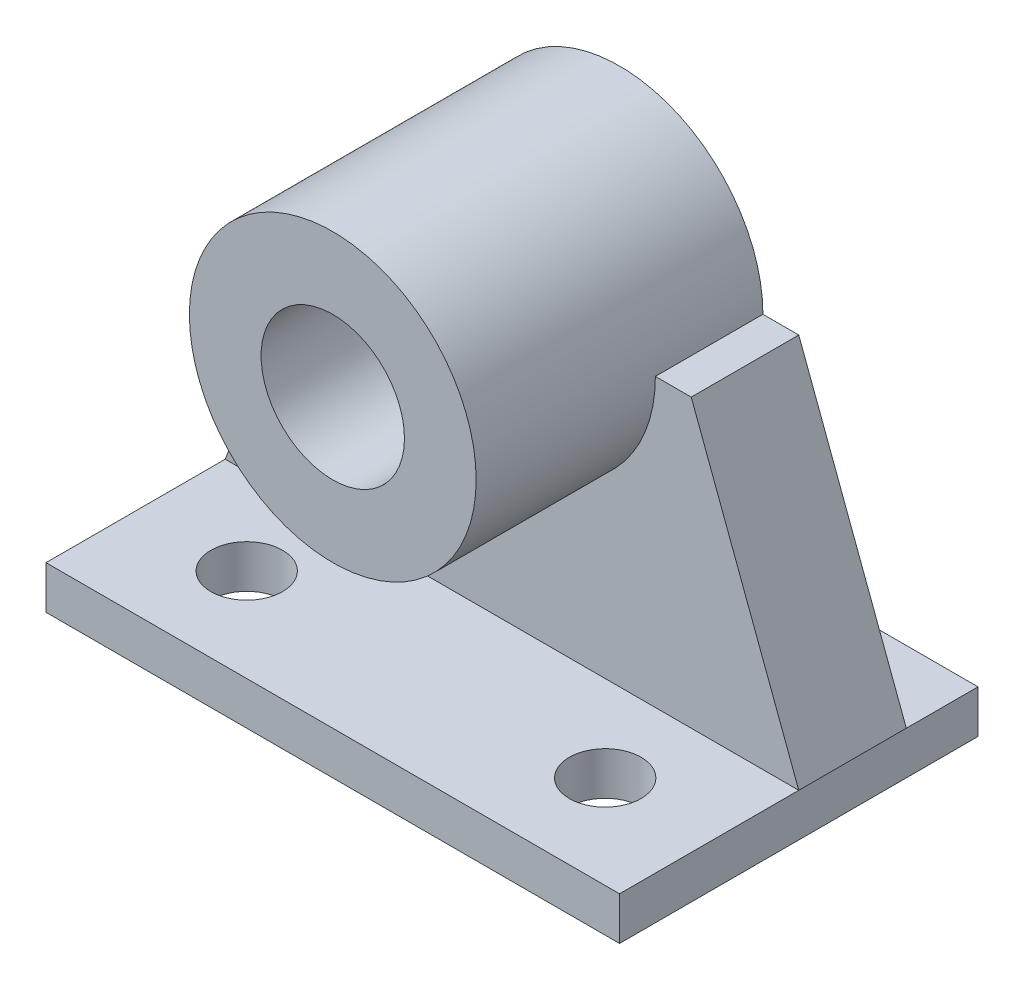
ISO-10303-21;
HEADER;
FILE_DESCRIPTION(('STEP AP214'),'2;1');
FILE_NAME('part.step','',(''),(''),'','','');
FILE_SCHEMA(('AUTOMOTIVE_DESIGN { 1 0 10303 214 1 1 1 1 }'));
ENDSEC;
DATA;
#1=APPLICATION_CONTEXT('core data for automotive mechanical design processes');
#2=APPLICATION_PROTOCOL_DEFINITION('international standard','automotive_design',2000,#1);
#3=PRODUCT_CONTEXT('',#1,'mechanical');
#4=PRODUCT('Part','Part','',(#3));
#5=PRODUCT_RELATED_PRODUCT_CATEGORY('part','',(#4));
#6=PRODUCT_DEFINITION_FORMATION('','',#4);
#7=PRODUCT_DEFINITION_CONTEXT('part definition',#1,'design');
#8=PRODUCT_DEFINITION('design','',#6,#7);
#9=PRODUCT_DEFINITION_SHAPE('','',#8);
#10=(LENGTH_UNIT() NAMED_UNIT(*) SI_UNIT(.MILLI.,.METRE.));
#11=(NAMED_UNIT(*) PLANE_ANGLE_UNIT() SI_UNIT($,.RADIAN.));
#12=(NAMED_UNIT(*) SI_UNIT($,.STERADIAN.) SOLID_ANGLE_UNIT());
#13=UNCERTAINTY_MEASURE_WITH_UNIT(LENGTH_MEASURE(1.E-05),#10,'distance_accuracy_value','');
#14=(GEOMETRIC_REPRESENTATION_CONTEXT(3) GLOBAL_UNCERTAINTY_ASSIGNED_CONTEXT((#13)) GLOBAL_UNIT_ASSIGNED_CONTEXT((#10,
#11,#12)) REPRESENTATION_CONTEXT('',''));
#15=CARTESIAN_POINT('',(0.,0.,0.));
#16=DIRECTION('',(0.,0.,1.));
#17=DIRECTION('',(1.,0.,0.));
#18=AXIS2_PLACEMENT_3D('',#15,#16,#17);
#19=CARTESIAN_POINT('',(0.,0.,0.));
#20=DIRECTION('',(0.,0.,1.));
#21=DIRECTION('',(1.,0.,0.));
#22=AXIS2_PLACEMENT_3D('',#19,#20,#21);
#23=PLANE('',#22);
#24=DIRECTION('',(1.,0.,0.));
#25=VECTOR('',#24,1.);
#26=CARTESIAN_POINT('',(0.,40.,0.));
#27=LINE('',#26,#25);
#28=CARTESIAN_POINT('',(21.9143576826196,40.,0.));
#29=VERTEX_POINT('',#28);
#30=CARTESIAN_POINT('',(26.9143576826196,40.,0.));
#31=VERTEX_POINT('',#30);
#32=EDGE_CURVE('E127',#29,#31,#27,.T.);
#33=ORIENTED_EDGE('',*,*,#32,.F.);
#34=CARTESIAN_POINT('',(1.91435768261964,40.,0.));
#35=DIRECTION('',(0.,0.,1.));
#36=DIRECTION('',(1.,0.,0.));
#37=AXIS2_PLACEMENT_3D('',#34,#35,#36);
#38=CIRCLE('',#37,20.);
#39=CARTESIAN_POINT('',(-18.0856423173804,40.,0.));
#40=VERTEX_POINT('',#39);
#41=EDGE_CURVE('E11',#29,#40,#38,.F.);
#42=ORIENTED_EDGE('',*,*,#41,.T.);
#43=DIRECTION('',(1.,0.,0.));
#44=VECTOR('',#43,1.);
#45=CARTESIAN_POINT('',(0.,40.,0.));
#46=LINE('',#45,#44);
#47=CARTESIAN_POINT('',(-23.0856423173804,40.,0.));
#48=VERTEX_POINT('',#47);
#49=EDGE_CURVE('E116',#48,#40,#46,.T.);
#50=ORIENTED_EDGE('',*,*,#49,.F.);
#51=DIRECTION('',(0.351123441588391,0.936329177569045,0.));
#52=VECTOR('',#51,1.);
#53=CARTESIAN_POINT('',(-33.3901521686622,12.5213070632483,0.));
#54=LINE('',#53,#52);
#55=CARTESIAN_POINT('',(-38.0856423173804,0.,0.));
#56=VERTEX_POINT('',#55);
#57=EDGE_CURVE('E126',#56,#48,#54,.T.);
#58=ORIENTED_EDGE('',*,*,#57,.F.);
#59=DIRECTION('',(-1.,0.,0.));
#60=VECTOR('',#59,1.);
#61=CARTESIAN_POINT('',(0.,0.,0.));
#62=LINE('',#61,#60);
#63=CARTESIAN_POINT('',(41.9143576826196,0.,0.));
#64=VERTEX_POINT('',#63);
#65=EDGE_CURVE('E54',#64,#56,#62,.T.);
#66=ORIENTED_EDGE('',*,*,#65,.F.);
#67=DIRECTION('',(-0.351123441588392,0.936329177569045,0.));
#68=VECTOR('',#67,1.);
#69=CARTESIAN_POINT('',(36.7468341327076,13.7800627997654,0.));
#70=LINE('',#69,#68);
#71=EDGE_CURVE('E141',#64,#31,#70,.T.);
#72=ORIENTED_EDGE('',*,*,#71,.T.);
#73=EDGE_LOOP('',(#33,#42,#50,#58,#66,#72));
#74=FACE_BOUND('',#73,.T.);
#75=ADVANCED_FACE('F39',(#74),#23,.T.);
#76=CARTESIAN_POINT('',(-38.0856423173804,0.,-25.));
#77=DIRECTION('',(0.,1.,0.));
#78=DIRECTION('',(0.,0.,1.));
#79=AXIS2_PLACEMENT_3D('',#76,#77,#78);
#80=PLANE('',#79);
#81=CARTESIAN_POINT('',(-23.0856423173804,0.,12.));
#82=DIRECTION('',(0.,1.,0.));
#83=DIRECTION('',(0.,0.,1.));
#84=AXIS2_PLACEMENT_3D('',#81,#82,#83);
#85=CIRCLE('',#84,5.);
#86=CARTESIAN_POINT('',(-23.0856423173804,0.,17.));
#87=VERTEX_POINT('',#86);
#88=EDGE_CURVE('E440',#87,#87,#85,.T.);
#89=ORIENTED_EDGE('',*,*,#88,.F.);
#90=EDGE_LOOP('',(#89));
#91=FACE_BOUND('',#90,.T.);
#92=CARTESIAN_POINT('',(26.9143576826196,0.,12.));
#93=DIRECTION('',(0.,1.,0.));
#94=DIRECTION('',(0.,0.,1.));
#95=AXIS2_PLACEMENT_3D('',#92,#93,#94);
#96=CIRCLE('',#95,5.);
#97=CARTESIAN_POINT('',(26.9143576826196,0.,17.));
#98=VERTEX_POINT('',#97);
#99=EDGE_CURVE('E450',#98,#98,#96,.T.);
#100=ORIENTED_EDGE('',*,*,#99,.F.);
#101=EDGE_LOOP('',(#100));
#102=FACE_BOUND('',#101,.T.);
#103=DIRECTION('',(0.,0.,1.));
#104=VECTOR('',#103,1.);
#105=CARTESIAN_POINT('',(41.9143576826196,0.,-25.));
#106=LINE('',#105,#104);
#107=CARTESIAN_POINT('',(41.9143576826196,0.,25.));
#108=VERTEX_POINT('',#107);
#109=EDGE_CURVE('E59',#64,#108,#106,.T.);
#110=ORIENTED_EDGE('',*,*,#109,.F.);
#111=ORIENTED_EDGE('',*,*,#65,.T.);
#112=DIRECTION('',(0.,0.,1.));
#113=VECTOR('',#112,1.);
#114=CARTESIAN_POINT('',(-38.0856423173804,0.,-25.));
#115=LINE('',#114,#113);
#116=CARTESIAN_POINT('',(-38.0856423173804,0.,25.));
#117=VERTEX_POINT('',#116);
#118=EDGE_CURVE('E192',#56,#117,#115,.T.);
#119=ORIENTED_EDGE('',*,*,#118,.T.);
#120=DIRECTION('',(-1.,0.,0.));
#121=VECTOR('',#120,1.);
#122=CARTESIAN_POINT('',(-38.0856423173804,0.,25.));
#123=LINE('',#122,#121);
#124=EDGE_CURVE('E171',#108,#117,#123,.T.);
#125=ORIENTED_EDGE('',*,*,#124,.F.);
#126=EDGE_LOOP('',(#110,#111,#119,#125));
#127=FACE_BOUND('',#126,.T.);
#128=ADVANCED_FACE('F207',(#91,#102,#127),#80,.T.);
#129=CARTESIAN_POINT('',(-38.0856423173804,-6.00000000000001,-25.));
#130=DIRECTION('',(-1.,0.,0.));
#131=DIRECTION('',(0.,0.,1.));
#132=AXIS2_PLACEMENT_3D('',#129,#130,#131);
#133=PLANE('',#132);
#134=DIRECTION('',(0.,-1.,0.));
#135=VECTOR('',#134,1.);
#136=CARTESIAN_POINT('',(-38.0856423173804,-6.00000000000001,25.));
#137=LINE('',#136,#135);
#138=CARTESIAN_POINT('',(-38.0856423173804,-6.00000000000001,25.));
#139=VERTEX_POINT('',#138);
#140=EDGE_CURVE('E159',#117,#139,#137,.T.);
#141=ORIENTED_EDGE('',*,*,#140,.F.);
#142=ORIENTED_EDGE('',*,*,#118,.F.);
#143=DIRECTION('',(0.,0.,1.));
#144=VECTOR('',#143,1.);
#145=CARTESIAN_POINT('',(-38.0856423173804,0.,-15.));
#146=LINE('',#145,#144);
#147=CARTESIAN_POINT('',(-38.0856423173804,0.,-15.));
#148=VERTEX_POINT('',#147);
#149=EDGE_CURVE('E162',#148,#56,#146,.T.);
#150=ORIENTED_EDGE('',*,*,#149,.F.);
#151=CARTESIAN_POINT('',(-38.0856423173804,0.,-25.));
#152=VERTEX_POINT('',#151);
#153=EDGE_CURVE('E47',#152,#148,#115,.T.);
#154=ORIENTED_EDGE('',*,*,#153,.F.);
#155=DIRECTION('',(0.,-1.,0.));
#156=VECTOR('',#155,1.);
#157=CARTESIAN_POINT('',(-38.0856423173804,-6.00000000000001,-25.));
#158=LINE('',#157,#156);
#159=CARTESIAN_POINT('',(-38.0856423173804,-6.00000000000001,-25.));
#160=VERTEX_POINT('',#159);
#161=EDGE_CURVE('E167',#152,#160,#158,.T.);
#162=ORIENTED_EDGE('',*,*,#161,.T.);
#163=DIRECTION('',(0.,0.,1.));
#164=VECTOR('',#163,1.);
#165=CARTESIAN_POINT('',(-38.0856423173804,-6.00000000000001,-25.));
#166=LINE('',#165,#164);
#167=EDGE_CURVE('E180',#160,#139,#166,.T.);
#168=ORIENTED_EDGE('',*,*,#167,.T.);
#169=EDGE_LOOP('',(#141,#142,#150,#154,#162,#168));
#170=FACE_BOUND('',#169,.T.);
#171=ADVANCED_FACE('F41',(#170),#133,.T.);
#172=DIRECTION('',(-1.,0.,0.));
#173=VECTOR('',#172,1.);
#174=CARTESIAN_POINT('',(0.,0.,-15.));
#175=LINE('',#174,#173);
#176=CARTESIAN_POINT('',(41.9143576826196,0.,-15.));
#177=VERTEX_POINT('',#176);
#178=EDGE_CURVE('E228',#177,#148,#175,.T.);
#179=ORIENTED_EDGE('',*,*,#178,.F.);
#180=CARTESIAN_POINT('',(41.9143576826196,0.,-25.));
#181=VERTEX_POINT('',#180);
#182=EDGE_CURVE('E193',#181,#177,#106,.T.);
#183=ORIENTED_EDGE('',*,*,#182,.F.);
#184=DIRECTION('',(-1.,0.,0.));
#185=VECTOR('',#184,1.);
#186=CARTESIAN_POINT('',(-38.0856423173804,0.,-25.));
#187=LINE('',#186,#185);
#188=EDGE_CURVE('E177',#181,#152,#187,.T.);
#189=ORIENTED_EDGE('',*,*,#188,.T.);
#190=ORIENTED_EDGE('',*,*,#153,.T.);
#191=EDGE_LOOP('',(#179,#183,#189,#190));
#192=FACE_BOUND('',#191,.T.);
#193=ADVANCED_FACE('F230',(#192),#80,.T.);
#194=CARTESIAN_POINT('',(41.9143576826196,0.,-25.));
#195=DIRECTION('',(1.,0.,0.));
#196=DIRECTION('',(0.,0.,-1.));
#197=AXIS2_PLACEMENT_3D('',#194,#195,#196);
#198=PLANE('',#197);
#199=DIRECTION('',(0.,1.,0.));
#200=VECTOR('',#199,1.);
#201=CARTESIAN_POINT('',(41.9143576826196,0.,25.));
#202=LINE('',#201,#200);
#203=CARTESIAN_POINT('',(41.9143576826196,-6.,25.));
#204=VERTEX_POINT('',#203);
#205=EDGE_CURVE('E186',#204,#108,#202,.T.);
#206=ORIENTED_EDGE('',*,*,#205,.F.);
#207=DIRECTION('',(0.,0.,1.));
#208=VECTOR('',#207,1.);
#209=CARTESIAN_POINT('',(41.9143576826196,-6.,-25.));
#210=LINE('',#209,#208);
#211=CARTESIAN_POINT('',(41.9143576826196,-6.,-25.));
#212=VERTEX_POINT('',#211);
#213=EDGE_CURVE('E196',#212,#204,#210,.T.);
#214=ORIENTED_EDGE('',*,*,#213,.F.);
#215=DIRECTION('',(0.,1.,0.));
#216=VECTOR('',#215,1.);
#217=CARTESIAN_POINT('',(41.9143576826196,0.,-25.));
#218=LINE('',#217,#216);
#219=EDGE_CURVE('E174',#212,#181,#218,.T.);
#220=ORIENTED_EDGE('',*,*,#219,.T.);
#221=ORIENTED_EDGE('',*,*,#182,.T.);
#222=DIRECTION('',(0.,0.,1.));
#223=VECTOR('',#222,1.);
#224=CARTESIAN_POINT('',(41.9143576826196,0.,-15.));
#225=LINE('',#224,#223);
#226=EDGE_CURVE('E160',#177,#64,#225,.T.);
#227=ORIENTED_EDGE('',*,*,#226,.T.);
#228=ORIENTED_EDGE('',*,*,#109,.T.);
#229=EDGE_LOOP('',(#206,#214,#220,#221,#227,#228));
#230=FACE_BOUND('',#229,.T.);
#231=ADVANCED_FACE('F232',(#230),#198,.T.);
#232=CARTESIAN_POINT('',(41.9143576826196,-6.,-25.));
#233=DIRECTION('',(0.,-1.,0.));
#234=DIRECTION('',(1.,0.,0.));
#235=AXIS2_PLACEMENT_3D('',#232,#233,#234);
#236=PLANE('',#235);
#237=CARTESIAN_POINT('',(-23.0856423173804,-6.00000000000001,12.));
#238=DIRECTION('',(0.,-1.,0.));
#239=DIRECTION('',(1.,0.,0.));
#240=AXIS2_PLACEMENT_3D('',#237,#238,#239);
#241=CIRCLE('',#240,5.);
#242=CARTESIAN_POINT('',(-18.0856423173804,-6.00000000000001,12.));
#243=VERTEX_POINT('',#242);
#244=EDGE_CURVE('E437',#243,#243,#241,.F.);
#245=ORIENTED_EDGE('',*,*,#244,.T.);
#246=EDGE_LOOP('',(#245));
#247=FACE_BOUND('',#246,.T.);
#248=CARTESIAN_POINT('',(26.9143576826196,-6.,12.));
#249=DIRECTION('',(0.,-1.,0.));
#250=DIRECTION('',(1.,0.,0.));
#251=AXIS2_PLACEMENT_3D('',#248,#249,#250);
#252=CIRCLE('',#251,5.);
#253=CARTESIAN_POINT('',(31.9143576826196,-6.,12.));
#254=VERTEX_POINT('',#253);
#255=EDGE_CURVE('E445',#254,#254,#252,.F.);
#256=ORIENTED_EDGE('',*,*,#255,.T.);
#257=EDGE_LOOP('',(#256));
#258=FACE_BOUND('',#257,.T.);
#259=DIRECTION('',(1.,0.,0.));
#260=VECTOR('',#259,1.);
#261=CARTESIAN_POINT('',(41.9143576826196,-6.,25.));
#262=LINE('',#261,#260);
#263=EDGE_CURVE('E183',#139,#204,#262,.T.);
#264=ORIENTED_EDGE('',*,*,#263,.F.);
#265=ORIENTED_EDGE('',*,*,#167,.F.);
#266=DIRECTION('',(1.,0.,0.));
#267=VECTOR('',#266,1.);
#268=CARTESIAN_POINT('',(41.9143576826196,-6.,-25.));
#269=LINE('',#268,#267);
#270=EDGE_CURVE('E170',#160,#212,#269,.T.);
#271=ORIENTED_EDGE('',*,*,#270,.T.);
#272=ORIENTED_EDGE('',*,*,#213,.T.);
#273=EDGE_LOOP('',(#264,#265,#271,#272));
#274=FACE_BOUND('',#273,.T.);
#275=ADVANCED_FACE('F203',(#247,#258,#274),#236,.T.);
#276=CARTESIAN_POINT('',(0.,0.,-25.));
#277=DIRECTION('',(0.,0.,-1.));
#278=DIRECTION('',(-1.,0.,0.));
#279=AXIS2_PLACEMENT_3D('',#276,#277,#278);
#280=PLANE('',#279);
#281=ORIENTED_EDGE('',*,*,#161,.F.);
#282=ORIENTED_EDGE('',*,*,#188,.F.);
#283=ORIENTED_EDGE('',*,*,#219,.F.);
#284=ORIENTED_EDGE('',*,*,#270,.F.);
#285=EDGE_LOOP('',(#281,#282,#283,#284));
#286=FACE_BOUND('',#285,.T.);
#287=ADVANCED_FACE('F236',(#286),#280,.T.);
#288=CARTESIAN_POINT('',(0.,0.,25.));
#289=DIRECTION('',(0.,0.,-1.));
#290=DIRECTION('',(-1.,0.,0.));
#291=AXIS2_PLACEMENT_3D('',#288,#289,#290);
#292=PLANE('',#291);
#293=ORIENTED_EDGE('',*,*,#140,.T.);
#294=ORIENTED_EDGE('',*,*,#263,.T.);
#295=ORIENTED_EDGE('',*,*,#205,.T.);
#296=ORIENTED_EDGE('',*,*,#124,.T.);
#297=EDGE_LOOP('',(#293,#294,#295,#296));
#298=FACE_BOUND('',#297,.T.);
#299=ADVANCED_FACE('F206',(#298),#292,.F.);
#300=CARTESIAN_POINT('',(0.,40.,-15.));
#301=DIRECTION('',(0.,-1.,0.));
#302=DIRECTION('',(0.,0.,-1.));
#303=AXIS2_PLACEMENT_3D('',#300,#301,#302);
#304=PLANE('',#303);
#305=ORIENTED_EDGE('',*,*,#32,.T.);
#306=DIRECTION('',(0.,0.,1.));
#307=VECTOR('',#306,1.);
#308=CARTESIAN_POINT('',(26.9143576826196,40.,-15.));
#309=LINE('',#308,#307);
#310=CARTESIAN_POINT('',(26.9143576826196,40.,-15.));
#311=VERTEX_POINT('',#310);
#312=EDGE_CURVE('E157',#311,#31,#309,.T.);
#313=ORIENTED_EDGE('',*,*,#312,.F.);
#314=DIRECTION('',(1.,0.,0.));
#315=VECTOR('',#314,1.);
#316=CARTESIAN_POINT('',(0.,40.,-15.));
#317=LINE('',#316,#315);
#318=CARTESIAN_POINT('',(21.9143576826196,40.,-15.));
#319=VERTEX_POINT('',#318);
#320=EDGE_CURVE('E156',#319,#311,#317,.T.);
#321=ORIENTED_EDGE('',*,*,#320,.F.);
#322=DIRECTION('',(0.,0.,1.));
#323=VECTOR('',#322,1.);
#324=CARTESIAN_POINT('',(21.9143576826196,40.,-15.));
#325=LINE('',#324,#323);
#326=EDGE_CURVE('E135',#319,#29,#325,.T.);
#327=ORIENTED_EDGE('',*,*,#326,.T.);
#328=EDGE_LOOP('',(#305,#313,#321,#327));
#329=FACE_BOUND('',#328,.T.);
#330=ADVANCED_FACE('F220',(#329),#304,.F.);
#331=CARTESIAN_POINT('',(36.7468341327076,13.7800627997654,-15.));
#332=DIRECTION('',(0.936329177569045,0.351123441588392,0.));
#333=DIRECTION('',(-0.351123441588392,0.936329177569045,0.));
#334=AXIS2_PLACEMENT_3D('',#331,#332,#333);
#335=PLANE('',#334);
#336=ORIENTED_EDGE('',*,*,#71,.F.);
#337=ORIENTED_EDGE('',*,*,#226,.F.);
#338=DIRECTION('',(-0.351123441588392,0.936329177569045,0.));
#339=VECTOR('',#338,1.);
#340=CARTESIAN_POINT('',(36.7468341327076,13.7800627997654,-15.));
#341=LINE('',#340,#339);
#342=EDGE_CURVE('E150',#177,#311,#341,.T.);
#343=ORIENTED_EDGE('',*,*,#342,.T.);
#344=ORIENTED_EDGE('',*,*,#312,.T.);
#345=EDGE_LOOP('',(#336,#337,#343,#344));
#346=FACE_BOUND('',#345,.T.);
#347=ADVANCED_FACE('F216',(#346),#335,.T.);
#348=CARTESIAN_POINT('',(-33.3901521686622,12.5213070632483,-15.));
#349=DIRECTION('',(0.936329177569045,-0.351123441588391,0.));
#350=DIRECTION('',(0.351123441588391,0.936329177569045,0.));
#351=AXIS2_PLACEMENT_3D('',#348,#349,#350);
#352=PLANE('',#351);
#353=ORIENTED_EDGE('',*,*,#57,.T.);
#354=DIRECTION('',(0.,0.,1.));
#355=VECTOR('',#354,1.);
#356=CARTESIAN_POINT('',(-23.0856423173804,40.,-15.));
#357=LINE('',#356,#355);
#358=CARTESIAN_POINT('',(-23.0856423173804,40.,-15.));
#359=VERTEX_POINT('',#358);
#360=EDGE_CURVE('E123',#359,#48,#357,.T.);
#361=ORIENTED_EDGE('',*,*,#360,.F.);
#362=DIRECTION('',(0.351123441588391,0.936329177569045,0.));
#363=VECTOR('',#362,1.);
#364=CARTESIAN_POINT('',(-33.3901521686622,12.5213070632483,-15.));
#365=LINE('',#364,#363);
#366=EDGE_CURVE('E213',#148,#359,#365,.T.);
#367=ORIENTED_EDGE('',*,*,#366,.F.);
#368=ORIENTED_EDGE('',*,*,#149,.T.);
#369=EDGE_LOOP('',(#353,#361,#367,#368));
#370=FACE_BOUND('',#369,.T.);
#371=ADVANCED_FACE('F212',(#370),#352,.F.);
#372=CARTESIAN_POINT('',(0.,40.,-15.));
#373=DIRECTION('',(0.,-1.,0.));
#374=DIRECTION('',(0.,0.,-1.));
#375=AXIS2_PLACEMENT_3D('',#372,#373,#374);
#376=PLANE('',#375);
#377=ORIENTED_EDGE('',*,*,#49,.T.);
#378=DIRECTION('',(0.,0.,1.));
#379=VECTOR('',#378,1.);
#380=CARTESIAN_POINT('',(-18.0856423173804,40.,-15.));
#381=LINE('',#380,#379);
#382=CARTESIAN_POINT('',(-18.0856423173804,40.,-15.));
#383=VERTEX_POINT('',#382);
#384=EDGE_CURVE('E120',#383,#40,#381,.T.);
#385=ORIENTED_EDGE('',*,*,#384,.F.);
#386=DIRECTION('',(1.,0.,0.));
#387=VECTOR('',#386,1.);
#388=CARTESIAN_POINT('',(0.,40.,-15.));
#389=LINE('',#388,#387);
#390=EDGE_CURVE('E224',#359,#383,#389,.T.);
#391=ORIENTED_EDGE('',*,*,#390,.F.);
#392=ORIENTED_EDGE('',*,*,#360,.T.);
#393=EDGE_LOOP('',(#377,#385,#391,#392));
#394=FACE_BOUND('',#393,.T.);
#395=ADVANCED_FACE('F118',(#394),#376,.F.);
#396=CARTESIAN_POINT('',(1.91435768261964,40.,-15.));
#397=DIRECTION('',(0.,0.,1.));
#398=DIRECTION('',(1.,0.,0.));
#399=AXIS2_PLACEMENT_3D('',#396,#397,#398);
#400=CYLINDRICAL_SURFACE('',#399,20.);
#401=ORIENTED_EDGE('',*,*,#384,.T.);
#402=ORIENTED_EDGE('',*,*,#41,.F.);
#403=ORIENTED_EDGE('',*,*,#326,.F.);
#404=CARTESIAN_POINT('',(1.91435768261964,40.,-15.));
#405=DIRECTION('',(0.,0.,1.));
#406=DIRECTION('',(1.,0.,0.));
#407=AXIS2_PLACEMENT_3D('',#404,#405,#406);
#408=CIRCLE('',#407,20.);
#409=EDGE_CURVE('E134',#319,#383,#408,.T.);
#410=ORIENTED_EDGE('',*,*,#409,.T.);
#411=EDGE_LOOP('',(#401,#402,#403,#410));
#412=FACE_BOUND('',#411,.T.);
#413=CARTESIAN_POINT('',(1.91435768261964,40.,25.));
#414=DIRECTION('',(0.,0.,1.));
#415=DIRECTION('',(1.,0.,0.));
#416=AXIS2_PLACEMENT_3D('',#413,#414,#415);
#417=CIRCLE('',#416,20.);
#418=CARTESIAN_POINT('',(21.9143576826196,40.,25.));
#419=VERTEX_POINT('',#418);
#420=EDGE_CURVE('E144',#419,#419,#417,.T.);
#421=ORIENTED_EDGE('',*,*,#420,.F.);
#422=EDGE_LOOP('',(#421));
#423=FACE_BOUND('',#422,.T.);
#424=ADVANCED_FACE('F131',(#412,#423),#400,.T.);
#425=CARTESIAN_POINT('',(0.,0.,-15.));
#426=DIRECTION('',(0.,0.,1.));
#427=DIRECTION('',(1.,0.,0.));
#428=AXIS2_PLACEMENT_3D('',#425,#426,#427);
#429=PLANE('',#428);
#430=CARTESIAN_POINT('',(1.91435768261964,40.,-15.));
#431=DIRECTION('',(0.,0.,1.));
#432=DIRECTION('',(1.,0.,0.));
#433=AXIS2_PLACEMENT_3D('',#430,#431,#432);
#434=CIRCLE('',#433,10.);
#435=CARTESIAN_POINT('',(11.9143576826196,40.,-15.));
#436=VERTEX_POINT('',#435);
#437=EDGE_CURVE('E147',#436,#436,#434,.F.);
#438=ORIENTED_EDGE('',*,*,#437,.F.);
#439=EDGE_LOOP('',(#438));
#440=FACE_BOUND('',#439,.T.);
#441=ORIENTED_EDGE('',*,*,#320,.T.);
#442=ORIENTED_EDGE('',*,*,#342,.F.);
#443=ORIENTED_EDGE('',*,*,#178,.T.);
#444=ORIENTED_EDGE('',*,*,#366,.T.);
#445=ORIENTED_EDGE('',*,*,#390,.T.);
#446=ORIENTED_EDGE('',*,*,#409,.F.);
#447=EDGE_LOOP('',(#441,#442,#443,#444,#445,#446));
#448=FACE_BOUND('',#447,.T.);
#449=ADVANCED_FACE('F223',(#440,#448),#429,.F.);
#450=CARTESIAN_POINT('',(1.91435768261964,40.,25.));
#451=DIRECTION('',(0.,0.,1.));
#452=DIRECTION('',(1.,0.,0.));
#453=AXIS2_PLACEMENT_3D('',#450,#451,#452);
#454=PLANE('',#453);
#455=CARTESIAN_POINT('',(1.91435768261964,40.,25.));
#456=DIRECTION('',(0.,0.,1.));
#457=DIRECTION('',(1.,0.,0.));
#458=AXIS2_PLACEMENT_3D('',#455,#456,#457);
#459=CIRCLE('',#458,10.);
#460=CARTESIAN_POINT('',(11.9143576826196,40.,25.));
#461=VERTEX_POINT('',#460);
#462=EDGE_CURVE('E441',#461,#461,#459,.T.);
#463=ORIENTED_EDGE('',*,*,#462,.F.);
#464=EDGE_LOOP('',(#463));
#465=FACE_BOUND('',#464,.T.);
#466=ORIENTED_EDGE('',*,*,#420,.T.);
#467=EDGE_LOOP('',(#466));
#468=FACE_BOUND('',#467,.T.);
#469=ADVANCED_FACE('F291',(#465,#468),#454,.T.);
#470=CARTESIAN_POINT('',(1.91435768261964,40.,-25.001));
#471=DIRECTION('',(0.,0.,1.));
#472=DIRECTION('',(1.,0.,0.));
#473=AXIS2_PLACEMENT_3D('',#470,#471,#472);
#474=CYLINDRICAL_SURFACE('',#473,10.);
#475=ORIENTED_EDGE('',*,*,#462,.T.);
#476=EDGE_LOOP('',(#475));
#477=FACE_BOUND('',#476,.T.);
#478=ORIENTED_EDGE('',*,*,#437,.T.);
#479=EDGE_LOOP('',(#478));
#480=FACE_BOUND('',#479,.T.);
#481=ADVANCED_FACE('F298',(#477,#480),#474,.F.);
#482=CARTESIAN_POINT('',(26.9143576826196,-6.00100000000001,12.));
#483=DIRECTION('',(0.,1.,0.));
#484=DIRECTION('',(0.,0.,1.));
#485=AXIS2_PLACEMENT_3D('',#482,#483,#484);
#486=CYLINDRICAL_SURFACE('',#485,5.);
#487=ORIENTED_EDGE('',*,*,#255,.F.);
#488=EDGE_LOOP('',(#487));
#489=FACE_BOUND('',#488,.T.);
#490=ORIENTED_EDGE('',*,*,#99,.T.);
#491=EDGE_LOOP('',(#490));
#492=FACE_BOUND('',#491,.T.);
#493=ADVANCED_FACE('F305',(#489,#492),#486,.F.);
#494=CARTESIAN_POINT('',(-23.0856423173804,-6.00100000000001,12.));
#495=DIRECTION('',(0.,1.,0.));
#496=DIRECTION('',(0.,0.,1.));
#497=AXIS2_PLACEMENT_3D('',#494,#495,#496);
#498=CYLINDRICAL_SURFACE('',#497,5.);
#499=ORIENTED_EDGE('',*,*,#244,.F.);
#500=EDGE_LOOP('',(#499));
#501=FACE_BOUND('',#500,.T.);
#502=ORIENTED_EDGE('',*,*,#88,.T.);
#503=EDGE_LOOP('',(#502));
#504=FACE_BOUND('',#503,.T.);
#505=ADVANCED_FACE('F314',(#501,#504),#498,.F.);
#506=CLOSED_SHELL('',(#75,#128,#171,#193,#231,#275,#287,#299,#330,#347,#371,#395,#424,#449,#469,
#481,#493,#505));
#507=MANIFOLD_SOLID_BREP('B2',#506);
#508=ADVANCED_BREP_SHAPE_REPRESENTATION('',(#18,#507),#14);
#509=SHAPE_DEFINITION_REPRESENTATION(#9,#508);
ENDSEC;
END-ISO-10303-21;
